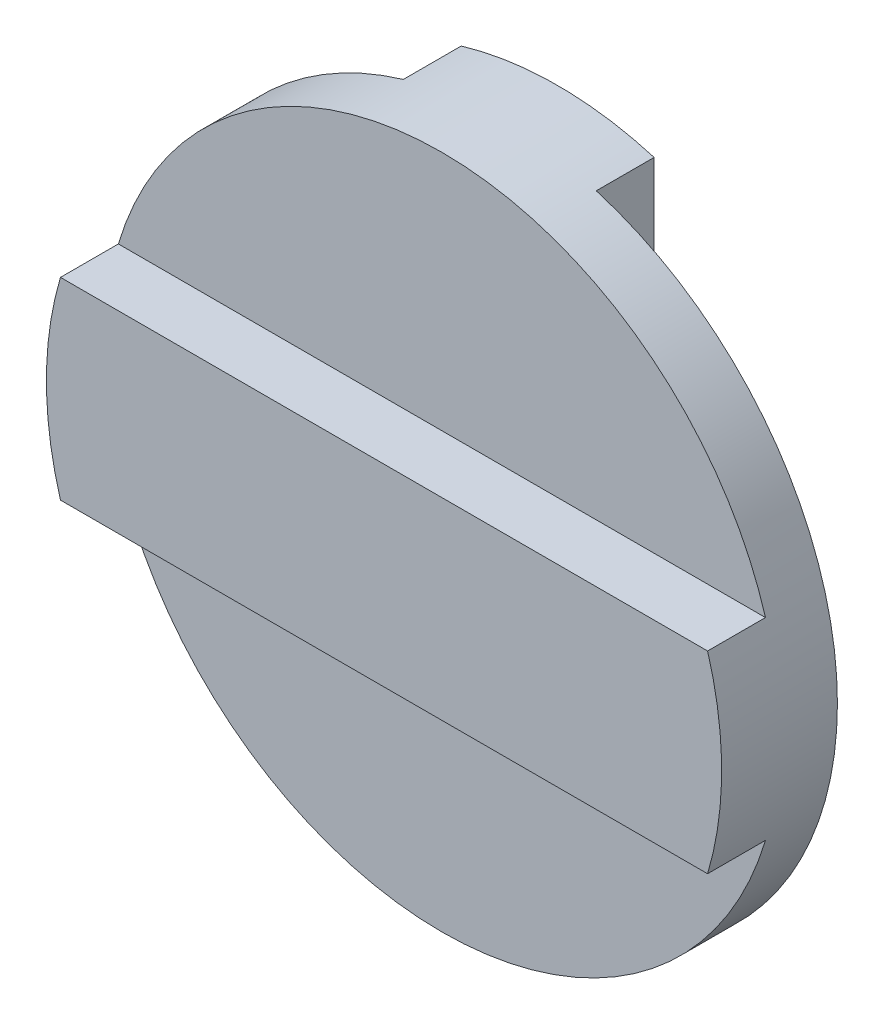
ISO-10303-21;
HEADER;
FILE_DESCRIPTION(('STEP AP214'),'2;1');
FILE_NAME('part.step','',(''),(''),'','','');
FILE_SCHEMA(('AUTOMOTIVE_DESIGN { 1 0 10303 214 1 1 1 1 }'));
ENDSEC;
DATA;
#1=APPLICATION_CONTEXT('core data for automotive mechanical design processes');
#2=APPLICATION_PROTOCOL_DEFINITION('international standard','automotive_design',2000,#1);
#3=PRODUCT_CONTEXT('',#1,'mechanical');
#4=PRODUCT('Part','Part','',(#3));
#5=PRODUCT_RELATED_PRODUCT_CATEGORY('part','',(#4));
#6=PRODUCT_DEFINITION_FORMATION('','',#4);
#7=PRODUCT_DEFINITION_CONTEXT('part definition',#1,'design');
#8=PRODUCT_DEFINITION('design','',#6,#7);
#9=PRODUCT_DEFINITION_SHAPE('','',#8);
#10=(LENGTH_UNIT() NAMED_UNIT(*) SI_UNIT(.MILLI.,.METRE.));
#11=(NAMED_UNIT(*) PLANE_ANGLE_UNIT() SI_UNIT($,.RADIAN.));
#12=(NAMED_UNIT(*) SI_UNIT($,.STERADIAN.) SOLID_ANGLE_UNIT());
#13=UNCERTAINTY_MEASURE_WITH_UNIT(LENGTH_MEASURE(1.E-05),#10,'distance_accuracy_value','');
#14=(GEOMETRIC_REPRESENTATION_CONTEXT(3) GLOBAL_UNCERTAINTY_ASSIGNED_CONTEXT((#13)) GLOBAL_UNIT_ASSIGNED_CONTEXT((#10,
#11,#12)) REPRESENTATION_CONTEXT('',''));
#15=CARTESIAN_POINT('',(0.,0.,0.));
#16=DIRECTION('',(0.,0.,1.));
#17=DIRECTION('',(1.,0.,0.));
#18=AXIS2_PLACEMENT_3D('',#15,#16,#17);
#19=CARTESIAN_POINT('',(0.,0.,-1.5));
#20=DIRECTION('',(0.,0.,1.));
#21=DIRECTION('',(1.,0.,0.));
#22=AXIS2_PLACEMENT_3D('',#19,#20,#21);
#23=PLANE('',#22);
#24=DIRECTION('',(0.,1.,0.));
#25=VECTOR('',#24,1.);
#26=CARTESIAN_POINT('',(-5.,16.7705098312484,-1.5));
#27=LINE('',#26,#25);
#28=CARTESIAN_POINT('',(-5.,-16.7705098312484,-1.5));
#29=VERTEX_POINT('',#28);
#30=CARTESIAN_POINT('',(-5.,16.7705098312484,-1.5));
#31=VERTEX_POINT('',#30);
#32=EDGE_CURVE('E48',#29,#31,#27,.T.);
#33=ORIENTED_EDGE('',*,*,#32,.F.);
#34=CARTESIAN_POINT('',(0.,0.,-1.5));
#35=DIRECTION('',(0.,0.,1.));
#36=DIRECTION('',(1.,0.,0.));
#37=AXIS2_PLACEMENT_3D('',#34,#35,#36);
#38=CIRCLE('',#37,17.5);
#39=EDGE_CURVE('E51',#31,#29,#38,.T.);
#40=ORIENTED_EDGE('',*,*,#39,.F.);
#41=EDGE_LOOP('',(#33,#40));
#42=FACE_BOUND('',#41,.T.);
#43=ADVANCED_FACE('F33',(#42),#23,.F.);
#44=DIRECTION('',(0.,-1.,0.));
#45=VECTOR('',#44,1.);
#46=CARTESIAN_POINT('',(5.,16.7705098312484,-1.5));
#47=LINE('',#46,#45);
#48=CARTESIAN_POINT('',(5.,16.7705098312484,-1.5));
#49=VERTEX_POINT('',#48);
#50=CARTESIAN_POINT('',(5.,-16.7705098312484,-1.5));
#51=VERTEX_POINT('',#50);
#52=EDGE_CURVE('E271',#49,#51,#47,.T.);
#53=ORIENTED_EDGE('',*,*,#52,.F.);
#54=EDGE_CURVE('E37',#51,#49,#38,.T.);
#55=ORIENTED_EDGE('',*,*,#54,.F.);
#56=EDGE_LOOP('',(#53,#55));
#57=FACE_BOUND('',#56,.T.);
#58=ADVANCED_FACE('F171',(#57),#23,.F.);
#59=CARTESIAN_POINT('',(0.,0.,1.5));
#60=DIRECTION('',(0.,0.,1.));
#61=DIRECTION('',(1.,0.,0.));
#62=AXIS2_PLACEMENT_3D('',#59,#60,#61);
#63=PLANE('',#62);
#64=CARTESIAN_POINT('',(0.,0.,1.5));
#65=DIRECTION('',(0.,0.,1.));
#66=DIRECTION('',(1.,0.,0.));
#67=AXIS2_PLACEMENT_3D('',#64,#65,#66);
#68=CIRCLE('',#67,17.5);
#69=CARTESIAN_POINT('',(16.7705098312484,5.,1.5));
#70=VERTEX_POINT('',#69);
#71=CARTESIAN_POINT('',(-16.7705098312484,5.,1.5));
#72=VERTEX_POINT('',#71);
#73=EDGE_CURVE('E11',#70,#72,#68,.T.);
#74=ORIENTED_EDGE('',*,*,#73,.T.);
#75=DIRECTION('',(1.,0.,0.));
#76=VECTOR('',#75,1.);
#77=CARTESIAN_POINT('',(-16.7705098312484,5.,1.5));
#78=LINE('',#77,#76);
#79=EDGE_CURVE('E120',#72,#70,#78,.T.);
#80=ORIENTED_EDGE('',*,*,#79,.T.);
#81=EDGE_LOOP('',(#74,#80));
#82=FACE_BOUND('',#81,.T.);
#83=ADVANCED_FACE('F169',(#82),#63,.T.);
#84=CARTESIAN_POINT('',(0.,0.,1.5));
#85=DIRECTION('',(0.,0.,-1.));
#86=DIRECTION('',(-1.,0.,0.));
#87=AXIS2_PLACEMENT_3D('',#84,#85,#86);
#88=CYLINDRICAL_SURFACE('',#87,17.5);
#89=ORIENTED_EDGE('',*,*,#73,.F.);
#90=DIRECTION('',(0.,0.,-1.));
#91=VECTOR('',#90,1.);
#92=CARTESIAN_POINT('',(16.7705098312484,5.,4.5));
#93=LINE('',#92,#91);
#94=CARTESIAN_POINT('',(16.7705098312484,5.,4.5));
#95=VERTEX_POINT('',#94);
#96=EDGE_CURVE('E140',#95,#70,#93,.T.);
#97=ORIENTED_EDGE('',*,*,#96,.F.);
#98=CARTESIAN_POINT('',(0.,0.,4.5));
#99=DIRECTION('',(0.,0.,1.));
#100=DIRECTION('',(1.,0.,0.));
#101=AXIS2_PLACEMENT_3D('',#98,#99,#100);
#102=CIRCLE('',#101,17.5);
#103=CARTESIAN_POINT('',(16.7705098312484,-5.00000000000001,4.5));
#104=VERTEX_POINT('',#103);
#105=EDGE_CURVE('E131',#104,#95,#102,.T.);
#106=ORIENTED_EDGE('',*,*,#105,.F.);
#107=DIRECTION('',(0.,0.,-1.));
#108=VECTOR('',#107,1.);
#109=CARTESIAN_POINT('',(16.7705098312484,-5.00000000000001,4.5));
#110=LINE('',#109,#108);
#111=CARTESIAN_POINT('',(16.7705098312484,-5.00000000000001,1.5));
#112=VERTEX_POINT('',#111);
#113=EDGE_CURVE('E143',#104,#112,#110,.T.);
#114=ORIENTED_EDGE('',*,*,#113,.T.);
#115=CARTESIAN_POINT('',(-16.7705098312484,-5.,1.5));
#116=VERTEX_POINT('',#115);
#117=EDGE_CURVE('E42',#116,#112,#68,.T.);
#118=ORIENTED_EDGE('',*,*,#117,.F.);
#119=DIRECTION('',(0.,0.,-1.));
#120=VECTOR('',#119,1.);
#121=CARTESIAN_POINT('',(-16.7705098312484,-5.,4.5));
#122=LINE('',#121,#120);
#123=CARTESIAN_POINT('',(-16.7705098312484,-5.,4.5));
#124=VERTEX_POINT('',#123);
#125=EDGE_CURVE('E146',#124,#116,#122,.T.);
#126=ORIENTED_EDGE('',*,*,#125,.F.);
#127=CARTESIAN_POINT('',(0.,0.,4.5));
#128=DIRECTION('',(0.,0.,1.));
#129=DIRECTION('',(1.,0.,0.));
#130=AXIS2_PLACEMENT_3D('',#127,#128,#129);
#131=CIRCLE('',#130,17.5);
#132=CARTESIAN_POINT('',(-16.7705098312484,5.,4.5));
#133=VERTEX_POINT('',#132);
#134=EDGE_CURVE('E126',#133,#124,#131,.T.);
#135=ORIENTED_EDGE('',*,*,#134,.F.);
#136=DIRECTION('',(0.,0.,-1.));
#137=VECTOR('',#136,1.);
#138=CARTESIAN_POINT('',(-16.7705098312484,5.,4.5));
#139=LINE('',#138,#137);
#140=EDGE_CURVE('E135',#133,#72,#139,.T.);
#141=ORIENTED_EDGE('',*,*,#140,.T.);
#142=EDGE_LOOP('',(#89,#97,#106,#114,#118,#126,#135,#141));
#143=FACE_BOUND('',#142,.T.);
#144=ORIENTED_EDGE('',*,*,#54,.T.);
#145=DIRECTION('',(0.,0.,1.));
#146=VECTOR('',#145,1.);
#147=CARTESIAN_POINT('',(5.,16.7705098312484,-4.5));
#148=LINE('',#147,#146);
#149=CARTESIAN_POINT('',(5.,16.7705098312484,-4.5));
#150=VERTEX_POINT('',#149);
#151=EDGE_CURVE('E100',#150,#49,#148,.T.);
#152=ORIENTED_EDGE('',*,*,#151,.F.);
#153=CARTESIAN_POINT('',(0.,0.,-4.5));
#154=DIRECTION('',(0.,0.,-1.));
#155=DIRECTION('',(-1.,0.,0.));
#156=AXIS2_PLACEMENT_3D('',#153,#154,#155);
#157=CIRCLE('',#156,17.5);
#158=CARTESIAN_POINT('',(-5.,16.7705098312484,-4.5));
#159=VERTEX_POINT('',#158);
#160=EDGE_CURVE('E106',#159,#150,#157,.T.);
#161=ORIENTED_EDGE('',*,*,#160,.F.);
#162=DIRECTION('',(0.,0.,1.));
#163=VECTOR('',#162,1.);
#164=CARTESIAN_POINT('',(-5.,16.7705098312484,-4.5));
#165=LINE('',#164,#163);
#166=EDGE_CURVE('E270',#159,#31,#165,.T.);
#167=ORIENTED_EDGE('',*,*,#166,.T.);
#168=ORIENTED_EDGE('',*,*,#39,.T.);
#169=DIRECTION('',(0.,0.,1.));
#170=VECTOR('',#169,1.);
#171=CARTESIAN_POINT('',(-5.,-16.7705098312484,-4.5));
#172=LINE('',#171,#170);
#173=CARTESIAN_POINT('',(-5.,-16.7705098312484,-4.5));
#174=VERTEX_POINT('',#173);
#175=EDGE_CURVE('E122',#174,#29,#172,.T.);
#176=ORIENTED_EDGE('',*,*,#175,.F.);
#177=CARTESIAN_POINT('',(0.,0.,-4.5));
#178=DIRECTION('',(0.,0.,-1.));
#179=DIRECTION('',(-1.,0.,0.));
#180=AXIS2_PLACEMENT_3D('',#177,#178,#179);
#181=CIRCLE('',#180,17.5);
#182=CARTESIAN_POINT('',(5.,-16.7705098312484,-4.5));
#183=VERTEX_POINT('',#182);
#184=EDGE_CURVE('E105',#183,#174,#181,.T.);
#185=ORIENTED_EDGE('',*,*,#184,.F.);
#186=DIRECTION('',(0.,0.,1.));
#187=VECTOR('',#186,1.);
#188=CARTESIAN_POINT('',(5.,-16.7705098312484,-4.5));
#189=LINE('',#188,#187);
#190=EDGE_CURVE('E102',#183,#51,#189,.T.);
#191=ORIENTED_EDGE('',*,*,#190,.T.);
#192=EDGE_LOOP('',(#144,#152,#161,#167,#168,#176,#185,#191));
#193=FACE_BOUND('',#192,.T.);
#194=ADVANCED_FACE('F35',(#143,#193),#88,.T.);
#195=DIRECTION('',(1.,0.,0.));
#196=VECTOR('',#195,1.);
#197=CARTESIAN_POINT('',(-16.7705098312484,-5.,1.5));
#198=LINE('',#197,#196);
#199=EDGE_CURVE('E117',#116,#112,#198,.T.);
#200=ORIENTED_EDGE('',*,*,#199,.F.);
#201=ORIENTED_EDGE('',*,*,#117,.T.);
#202=EDGE_LOOP('',(#200,#201));
#203=FACE_BOUND('',#202,.T.);
#204=ADVANCED_FACE('F154',(#203),#63,.T.);
#205=CARTESIAN_POINT('',(-16.7705098312484,-5.,4.5));
#206=DIRECTION('',(0.,1.,0.));
#207=DIRECTION('',(0.,0.,1.));
#208=AXIS2_PLACEMENT_3D('',#205,#206,#207);
#209=PLANE('',#208);
#210=ORIENTED_EDGE('',*,*,#199,.T.);
#211=ORIENTED_EDGE('',*,*,#113,.F.);
#212=DIRECTION('',(1.,0.,0.));
#213=VECTOR('',#212,1.);
#214=CARTESIAN_POINT('',(-16.7705098312484,-5.,4.5));
#215=LINE('',#214,#213);
#216=EDGE_CURVE('E129',#124,#104,#215,.T.);
#217=ORIENTED_EDGE('',*,*,#216,.F.);
#218=ORIENTED_EDGE('',*,*,#125,.T.);
#219=EDGE_LOOP('',(#210,#211,#217,#218));
#220=FACE_BOUND('',#219,.T.);
#221=ADVANCED_FACE('F157',(#220),#209,.F.);
#222=CARTESIAN_POINT('',(-16.7705098312484,5.,4.5));
#223=DIRECTION('',(0.,1.,0.));
#224=DIRECTION('',(0.,0.,1.));
#225=AXIS2_PLACEMENT_3D('',#222,#223,#224);
#226=PLANE('',#225);
#227=ORIENTED_EDGE('',*,*,#79,.F.);
#228=ORIENTED_EDGE('',*,*,#140,.F.);
#229=DIRECTION('',(1.,0.,0.));
#230=VECTOR('',#229,1.);
#231=CARTESIAN_POINT('',(-16.7705098312484,5.,4.5));
#232=LINE('',#231,#230);
#233=EDGE_CURVE('E133',#133,#95,#232,.T.);
#234=ORIENTED_EDGE('',*,*,#233,.T.);
#235=ORIENTED_EDGE('',*,*,#96,.T.);
#236=EDGE_LOOP('',(#227,#228,#234,#235));
#237=FACE_BOUND('',#236,.T.);
#238=ADVANCED_FACE('F167',(#237),#226,.T.);
#239=CARTESIAN_POINT('',(0.,0.,4.5));
#240=DIRECTION('',(0.,0.,1.));
#241=DIRECTION('',(1.,0.,0.));
#242=AXIS2_PLACEMENT_3D('',#239,#240,#241);
#243=PLANE('',#242);
#244=ORIENTED_EDGE('',*,*,#134,.T.);
#245=ORIENTED_EDGE('',*,*,#216,.T.);
#246=ORIENTED_EDGE('',*,*,#105,.T.);
#247=ORIENTED_EDGE('',*,*,#233,.F.);
#248=EDGE_LOOP('',(#244,#245,#246,#247));
#249=FACE_BOUND('',#248,.T.);
#250=ADVANCED_FACE('F163',(#249),#243,.T.);
#251=CARTESIAN_POINT('',(5.,16.7705098312484,-4.5));
#252=DIRECTION('',(-1.,0.,0.));
#253=DIRECTION('',(0.,0.,1.));
#254=AXIS2_PLACEMENT_3D('',#251,#252,#253);
#255=PLANE('',#254);
#256=ORIENTED_EDGE('',*,*,#52,.T.);
#257=ORIENTED_EDGE('',*,*,#190,.F.);
#258=DIRECTION('',(0.,-1.,0.));
#259=VECTOR('',#258,1.);
#260=CARTESIAN_POINT('',(5.,16.7705098312484,-4.5));
#261=LINE('',#260,#259);
#262=EDGE_CURVE('E95',#150,#183,#261,.T.);
#263=ORIENTED_EDGE('',*,*,#262,.F.);
#264=ORIENTED_EDGE('',*,*,#151,.T.);
#265=EDGE_LOOP('',(#256,#257,#263,#264));
#266=FACE_BOUND('',#265,.T.);
#267=ADVANCED_FACE('F98',(#266),#255,.F.);
#268=CARTESIAN_POINT('',(-5.,16.7705098312484,-4.5));
#269=DIRECTION('',(1.,0.,0.));
#270=DIRECTION('',(0.,0.,-1.));
#271=AXIS2_PLACEMENT_3D('',#268,#269,#270);
#272=PLANE('',#271);
#273=ORIENTED_EDGE('',*,*,#32,.T.);
#274=ORIENTED_EDGE('',*,*,#166,.F.);
#275=DIRECTION('',(0.,1.,0.));
#276=VECTOR('',#275,1.);
#277=CARTESIAN_POINT('',(-5.,16.7705098312484,-4.5));
#278=LINE('',#277,#276);
#279=EDGE_CURVE('E111',#174,#159,#278,.T.);
#280=ORIENTED_EDGE('',*,*,#279,.F.);
#281=ORIENTED_EDGE('',*,*,#175,.T.);
#282=EDGE_LOOP('',(#273,#274,#280,#281));
#283=FACE_BOUND('',#282,.T.);
#284=ADVANCED_FACE('F205',(#283),#272,.F.);
#285=CARTESIAN_POINT('',(0.,0.,-4.5));
#286=DIRECTION('',(0.,0.,-1.));
#287=DIRECTION('',(-1.,0.,0.));
#288=AXIS2_PLACEMENT_3D('',#285,#286,#287);
#289=PLANE('',#288);
#290=ORIENTED_EDGE('',*,*,#160,.T.);
#291=ORIENTED_EDGE('',*,*,#262,.T.);
#292=ORIENTED_EDGE('',*,*,#184,.T.);
#293=ORIENTED_EDGE('',*,*,#279,.T.);
#294=EDGE_LOOP('',(#290,#291,#292,#293));
#295=FACE_BOUND('',#294,.T.);
#296=ADVANCED_FACE('F109',(#295),#289,.T.);
#297=CLOSED_SHELL('',(#43,#58,#83,#194,#204,#221,#238,#250,#267,#284,#296));
#298=MANIFOLD_SOLID_BREP('B2',#297);
#299=ADVANCED_BREP_SHAPE_REPRESENTATION('',(#18,#298),#14);
#300=SHAPE_DEFINITION_REPRESENTATION(#9,#299);
ENDSEC;
END-ISO-10303-21;
